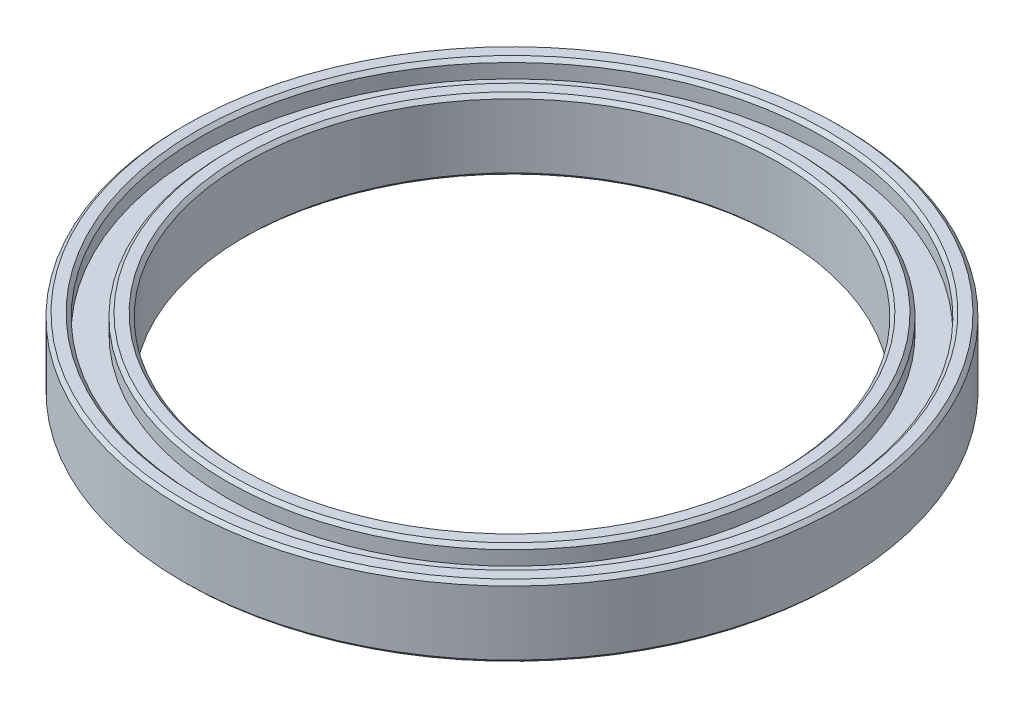
ISO-10303-21;
HEADER;
FILE_DESCRIPTION(('STEP AP214'),'2;1');
FILE_NAME('part.step','',(''),(''),'','','');
FILE_SCHEMA(('AUTOMOTIVE_DESIGN { 1 0 10303 214 1 1 1 1 }'));
ENDSEC;
DATA;
#1=APPLICATION_CONTEXT('core data for automotive mechanical design processes');
#2=APPLICATION_PROTOCOL_DEFINITION('international standard','automotive_design',2000,#1);
#3=PRODUCT_CONTEXT('',#1,'mechanical');
#4=PRODUCT('Part','Part','',(#3));
#5=PRODUCT_RELATED_PRODUCT_CATEGORY('part','',(#4));
#6=PRODUCT_DEFINITION_FORMATION('','',#4);
#7=PRODUCT_DEFINITION_CONTEXT('part definition',#1,'design');
#8=PRODUCT_DEFINITION('design','',#6,#7);
#9=PRODUCT_DEFINITION_SHAPE('','',#8);
#10=(LENGTH_UNIT() NAMED_UNIT(*) SI_UNIT(.MILLI.,.METRE.));
#11=(NAMED_UNIT(*) PLANE_ANGLE_UNIT() SI_UNIT($,.RADIAN.));
#12=(NAMED_UNIT(*) SI_UNIT($,.STERADIAN.) SOLID_ANGLE_UNIT());
#13=UNCERTAINTY_MEASURE_WITH_UNIT(LENGTH_MEASURE(1.E-05),#10,'distance_accuracy_value','');
#14=(GEOMETRIC_REPRESENTATION_CONTEXT(3) GLOBAL_UNCERTAINTY_ASSIGNED_CONTEXT((#13)) GLOBAL_UNIT_ASSIGNED_CONTEXT((#10,
#11,#12)) REPRESENTATION_CONTEXT('',''));
#15=CARTESIAN_POINT('',(0.,0.,0.));
#16=DIRECTION('',(0.,0.,1.));
#17=DIRECTION('',(1.,0.,0.));
#18=AXIS2_PLACEMENT_3D('',#15,#16,#17);
#19=CARTESIAN_POINT('',(0.,0.,0.));
#20=DIRECTION('',(0.,1.,0.));
#21=DIRECTION('',(0.,0.,1.));
#22=AXIS2_PLACEMENT_3D('',#19,#20,#21);
#23=PLANE('',#22);
#24=CARTESIAN_POINT('',(0.,0.,0.));
#25=DIRECTION('',(0.,1.,0.));
#26=DIRECTION('',(0.,0.,1.));
#27=AXIS2_PLACEMENT_3D('',#24,#25,#26);
#28=CIRCLE('',#27,15.8);
#29=CARTESIAN_POINT('',(0.,0.,15.8));
#30=VERTEX_POINT('',#29);
#31=EDGE_CURVE('E51',#30,#30,#28,.F.);
#32=ORIENTED_EDGE('',*,*,#31,.T.);
#33=EDGE_LOOP('',(#32));
#34=FACE_BOUND('',#33,.T.);
#35=CARTESIAN_POINT('',(0.,0.,0.));
#36=DIRECTION('',(0.,1.,0.));
#37=DIRECTION('',(0.,0.,1.));
#38=AXIS2_PLACEMENT_3D('',#35,#36,#37);
#39=CIRCLE('',#38,15.2);
#40=CARTESIAN_POINT('',(0.,0.,15.2));
#41=VERTEX_POINT('',#40);
#42=EDGE_CURVE('E55',#41,#41,#39,.T.);
#43=ORIENTED_EDGE('',*,*,#42,.T.);
#44=EDGE_LOOP('',(#43));
#45=FACE_BOUND('',#44,.T.);
#46=ADVANCED_FACE('F43',(#34,#45),#23,.F.);
#47=CARTESIAN_POINT('',(0.,4.,0.));
#48=DIRECTION('',(0.,1.,0.));
#49=DIRECTION('',(0.,0.,1.));
#50=AXIS2_PLACEMENT_3D('',#47,#48,#49);
#51=PLANE('',#50);
#52=CARTESIAN_POINT('',(0.,4.,0.));
#53=DIRECTION('',(0.,1.,0.));
#54=DIRECTION('',(0.,0.,1.));
#55=AXIS2_PLACEMENT_3D('',#52,#53,#54);
#56=CIRCLE('',#55,15.8);
#57=CARTESIAN_POINT('',(0.,4.,15.8));
#58=VERTEX_POINT('',#57);
#59=EDGE_CURVE('E94',#58,#58,#56,.T.);
#60=ORIENTED_EDGE('',*,*,#59,.T.);
#61=EDGE_LOOP('',(#60));
#62=FACE_BOUND('',#61,.T.);
#63=CARTESIAN_POINT('',(0.,4.,0.));
#64=DIRECTION('',(0.,1.,0.));
#65=DIRECTION('',(0.,0.,1.));
#66=AXIS2_PLACEMENT_3D('',#63,#64,#65);
#67=CIRCLE('',#66,15.2);
#68=CARTESIAN_POINT('',(0.,4.,15.2));
#69=VERTEX_POINT('',#68);
#70=EDGE_CURVE('E97',#69,#69,#67,.F.);
#71=ORIENTED_EDGE('',*,*,#70,.T.);
#72=EDGE_LOOP('',(#71));
#73=FACE_BOUND('',#72,.T.);
#74=ADVANCED_FACE('F134',(#62,#73),#51,.T.);
#75=CARTESIAN_POINT('',(0.,4.,0.));
#76=DIRECTION('',(0.,1.,0.));
#77=DIRECTION('',(0.,0.,1.));
#78=AXIS2_PLACEMENT_3D('',#75,#76,#77);
#79=CIRCLE('',#78,18.3);
#80=CARTESIAN_POINT('',(0.,4.,18.3));
#81=VERTEX_POINT('',#80);
#82=EDGE_CURVE('E79',#81,#81,#79,.T.);
#83=ORIENTED_EDGE('',*,*,#82,.T.);
#84=EDGE_LOOP('',(#83));
#85=FACE_BOUND('',#84,.T.);
#86=CARTESIAN_POINT('',(0.,4.,0.));
#87=DIRECTION('',(0.,1.,0.));
#88=DIRECTION('',(0.,0.,1.));
#89=AXIS2_PLACEMENT_3D('',#86,#87,#88);
#90=CIRCLE('',#89,17.7);
#91=CARTESIAN_POINT('',(0.,4.,17.7));
#92=VERTEX_POINT('',#91);
#93=EDGE_CURVE('E82',#92,#92,#90,.F.);
#94=ORIENTED_EDGE('',*,*,#93,.T.);
#95=EDGE_LOOP('',(#94));
#96=FACE_BOUND('',#95,.T.);
#97=ADVANCED_FACE('F140',(#85,#96),#51,.T.);
#98=CARTESIAN_POINT('',(0.,0.,0.));
#99=DIRECTION('',(0.,1.,0.));
#100=DIRECTION('',(0.,0.,1.));
#101=AXIS2_PLACEMENT_3D('',#98,#99,#100);
#102=CIRCLE('',#101,18.3);
#103=CARTESIAN_POINT('',(0.,0.,18.3));
#104=VERTEX_POINT('',#103);
#105=EDGE_CURVE('E64',#104,#104,#102,.F.);
#106=ORIENTED_EDGE('',*,*,#105,.T.);
#107=EDGE_LOOP('',(#106));
#108=FACE_BOUND('',#107,.T.);
#109=CARTESIAN_POINT('',(0.,0.,0.));
#110=DIRECTION('',(0.,1.,0.));
#111=DIRECTION('',(0.,0.,1.));
#112=AXIS2_PLACEMENT_3D('',#109,#110,#111);
#113=CIRCLE('',#112,17.7);
#114=CARTESIAN_POINT('',(0.,0.,17.7));
#115=VERTEX_POINT('',#114);
#116=EDGE_CURVE('E67',#115,#115,#113,.T.);
#117=ORIENTED_EDGE('',*,*,#116,.T.);
#118=EDGE_LOOP('',(#117));
#119=FACE_BOUND('',#118,.T.);
#120=ADVANCED_FACE('F136',(#108,#119),#23,.F.);
#121=CARTESIAN_POINT('',(0.,4.,0.));
#122=DIRECTION('',(0.,-1.,0.));
#123=DIRECTION('',(0.,0.,-1.));
#124=AXIS2_PLACEMENT_3D('',#121,#122,#123);
#125=CYLINDRICAL_SURFACE('',#124,18.5);
#126=CARTESIAN_POINT('',(0.,3.80000000000003,0.));
#127=DIRECTION('',(0.,1.,0.));
#128=DIRECTION('',(0.,0.,1.));
#129=AXIS2_PLACEMENT_3D('',#126,#127,#128);
#130=CIRCLE('',#129,18.5);
#131=CARTESIAN_POINT('',(0.,3.80000000000003,18.5));
#132=VERTEX_POINT('',#131);
#133=EDGE_CURVE('E73',#132,#132,#130,.F.);
#134=ORIENTED_EDGE('',*,*,#133,.T.);
#135=EDGE_LOOP('',(#134));
#136=FACE_BOUND('',#135,.T.);
#137=CARTESIAN_POINT('',(0.,0.199999999999999,0.));
#138=DIRECTION('',(0.,1.,0.));
#139=DIRECTION('',(0.,0.,1.));
#140=AXIS2_PLACEMENT_3D('',#137,#138,#139);
#141=CIRCLE('',#140,18.5);
#142=CARTESIAN_POINT('',(0.,0.199999999999999,18.5));
#143=VERTEX_POINT('',#142);
#144=EDGE_CURVE('E76',#143,#143,#141,.T.);
#145=ORIENTED_EDGE('',*,*,#144,.T.);
#146=EDGE_LOOP('',(#145));
#147=FACE_BOUND('',#146,.T.);
#148=ADVANCED_FACE('F146',(#136,#147),#125,.T.);
#149=CARTESIAN_POINT('',(0.,4.,0.));
#150=DIRECTION('',(0.,-1.,0.));
#151=DIRECTION('',(0.,0.,-1.));
#152=AXIS2_PLACEMENT_3D('',#149,#150,#151);
#153=CYLINDRICAL_SURFACE('',#152,15.);
#154=CARTESIAN_POINT('',(0.,3.80000000000001,0.));
#155=DIRECTION('',(0.,1.,0.));
#156=DIRECTION('',(0.,0.,1.));
#157=AXIS2_PLACEMENT_3D('',#154,#155,#156);
#158=CIRCLE('',#157,15.);
#159=CARTESIAN_POINT('',(0.,3.80000000000001,15.));
#160=VERTEX_POINT('',#159);
#161=EDGE_CURVE('E85',#160,#160,#158,.T.);
#162=ORIENTED_EDGE('',*,*,#161,.T.);
#163=EDGE_LOOP('',(#162));
#164=FACE_BOUND('',#163,.T.);
#165=CARTESIAN_POINT('',(0.,0.199999999999997,0.));
#166=DIRECTION('',(0.,1.,0.));
#167=DIRECTION('',(0.,0.,1.));
#168=AXIS2_PLACEMENT_3D('',#165,#166,#167);
#169=CIRCLE('',#168,15.);
#170=CARTESIAN_POINT('',(0.,0.199999999999997,15.));
#171=VERTEX_POINT('',#170);
#172=EDGE_CURVE('E88',#171,#171,#169,.F.);
#173=ORIENTED_EDGE('',*,*,#172,.T.);
#174=EDGE_LOOP('',(#173));
#175=FACE_BOUND('',#174,.T.);
#176=ADVANCED_FACE('F152',(#164,#175),#153,.F.);
#177=CARTESIAN_POINT('',(0.,3.,0.));
#178=DIRECTION('',(0.,1.,0.));
#179=DIRECTION('',(0.,0.,1.));
#180=AXIS2_PLACEMENT_3D('',#177,#178,#179);
#181=CYLINDRICAL_SURFACE('',#180,17.5);
#182=CARTESIAN_POINT('',(0.,3.79999999999999,0.));
#183=DIRECTION('',(0.,1.,0.));
#184=DIRECTION('',(0.,0.,1.));
#185=AXIS2_PLACEMENT_3D('',#182,#183,#184);
#186=CIRCLE('',#185,17.5);
#187=CARTESIAN_POINT('',(0.,3.79999999999999,17.5));
#188=VERTEX_POINT('',#187);
#189=EDGE_CURVE('E70',#188,#188,#186,.T.);
#190=ORIENTED_EDGE('',*,*,#189,.T.);
#191=EDGE_LOOP('',(#190));
#192=FACE_BOUND('',#191,.T.);
#193=CARTESIAN_POINT('',(0.,3.,0.));
#194=DIRECTION('',(0.,1.,0.));
#195=DIRECTION('',(0.,0.,1.));
#196=AXIS2_PLACEMENT_3D('',#193,#194,#195);
#197=CIRCLE('',#196,17.5);
#198=CARTESIAN_POINT('',(0.,3.,17.5));
#199=VERTEX_POINT('',#198);
#200=EDGE_CURVE('E100',#199,#199,#197,.T.);
#201=ORIENTED_EDGE('',*,*,#200,.F.);
#202=EDGE_LOOP('',(#201));
#203=FACE_BOUND('',#202,.T.);
#204=ADVANCED_FACE('F225',(#192,#203),#181,.F.);
#205=CARTESIAN_POINT('',(0.,3.,0.));
#206=DIRECTION('',(0.,1.,0.));
#207=DIRECTION('',(0.,0.,1.));
#208=AXIS2_PLACEMENT_3D('',#205,#206,#207);
#209=PLANE('',#208);
#210=CARTESIAN_POINT('',(0.,3.,0.));
#211=DIRECTION('',(0.,1.,0.));
#212=DIRECTION('',(0.,0.,1.));
#213=AXIS2_PLACEMENT_3D('',#210,#211,#212);
#214=CIRCLE('',#213,16.);
#215=CARTESIAN_POINT('',(0.,3.,16.));
#216=VERTEX_POINT('',#215);
#217=EDGE_CURVE('E103',#216,#216,#214,.T.);
#218=ORIENTED_EDGE('',*,*,#217,.F.);
#219=EDGE_LOOP('',(#218));
#220=FACE_BOUND('',#219,.T.);
#221=ORIENTED_EDGE('',*,*,#200,.T.);
#222=EDGE_LOOP('',(#221));
#223=FACE_BOUND('',#222,.T.);
#224=ADVANCED_FACE('F130',(#220,#223),#209,.T.);
#225=CARTESIAN_POINT('',(0.,3.,0.));
#226=DIRECTION('',(0.,1.,0.));
#227=DIRECTION('',(0.,0.,1.));
#228=AXIS2_PLACEMENT_3D('',#225,#226,#227);
#229=CYLINDRICAL_SURFACE('',#228,16.);
#230=CARTESIAN_POINT('',(0.,3.80000000000001,0.));
#231=DIRECTION('',(0.,1.,0.));
#232=DIRECTION('',(0.,0.,1.));
#233=AXIS2_PLACEMENT_3D('',#230,#231,#232);
#234=CIRCLE('',#233,16.);
#235=CARTESIAN_POINT('',(0.,3.80000000000001,16.));
#236=VERTEX_POINT('',#235);
#237=EDGE_CURVE('E91',#236,#236,#234,.F.);
#238=ORIENTED_EDGE('',*,*,#237,.T.);
#239=EDGE_LOOP('',(#238));
#240=FACE_BOUND('',#239,.T.);
#241=ORIENTED_EDGE('',*,*,#217,.T.);
#242=EDGE_LOOP('',(#241));
#243=FACE_BOUND('',#242,.T.);
#244=ADVANCED_FACE('F123',(#240,#243),#229,.T.);
#245=CARTESIAN_POINT('',(0.,1.,0.));
#246=DIRECTION('',(0.,-1.,0.));
#247=DIRECTION('',(0.,0.,-1.));
#248=AXIS2_PLACEMENT_3D('',#245,#246,#247);
#249=CYLINDRICAL_SURFACE('',#248,17.5);
#250=CARTESIAN_POINT('',(0.,0.200000000000013,0.));
#251=DIRECTION('',(0.,1.,0.));
#252=DIRECTION('',(0.,0.,1.));
#253=AXIS2_PLACEMENT_3D('',#250,#251,#252);
#254=CIRCLE('',#253,17.5);
#255=CARTESIAN_POINT('',(0.,0.200000000000013,17.5));
#256=VERTEX_POINT('',#255);
#257=EDGE_CURVE('E59',#256,#256,#254,.F.);
#258=ORIENTED_EDGE('',*,*,#257,.T.);
#259=EDGE_LOOP('',(#258));
#260=FACE_BOUND('',#259,.T.);
#261=CARTESIAN_POINT('',(0.,1.,0.));
#262=DIRECTION('',(0.,-1.,0.));
#263=DIRECTION('',(0.,0.,-1.));
#264=AXIS2_PLACEMENT_3D('',#261,#262,#263);
#265=CIRCLE('',#264,17.5);
#266=CARTESIAN_POINT('',(0.,1.,-17.5));
#267=VERTEX_POINT('',#266);
#268=EDGE_CURVE('E106',#267,#267,#265,.T.);
#269=ORIENTED_EDGE('',*,*,#268,.F.);
#270=EDGE_LOOP('',(#269));
#271=FACE_BOUND('',#270,.T.);
#272=ADVANCED_FACE('F118',(#260,#271),#249,.F.);
#273=CARTESIAN_POINT('',(0.,1.,0.));
#274=DIRECTION('',(0.,-1.,0.));
#275=DIRECTION('',(0.,0.,-1.));
#276=AXIS2_PLACEMENT_3D('',#273,#274,#275);
#277=PLANE('',#276);
#278=CARTESIAN_POINT('',(0.,1.,0.));
#279=DIRECTION('',(0.,-1.,0.));
#280=DIRECTION('',(0.,0.,-1.));
#281=AXIS2_PLACEMENT_3D('',#278,#279,#280);
#282=CIRCLE('',#281,16.);
#283=CARTESIAN_POINT('',(0.,1.,-16.));
#284=VERTEX_POINT('',#283);
#285=EDGE_CURVE('E109',#284,#284,#282,.T.);
#286=ORIENTED_EDGE('',*,*,#285,.F.);
#287=EDGE_LOOP('',(#286));
#288=FACE_BOUND('',#287,.T.);
#289=ORIENTED_EDGE('',*,*,#268,.T.);
#290=EDGE_LOOP('',(#289));
#291=FACE_BOUND('',#290,.T.);
#292=ADVANCED_FACE('F115',(#288,#291),#277,.T.);
#293=CARTESIAN_POINT('',(0.,1.,0.));
#294=DIRECTION('',(0.,-1.,0.));
#295=DIRECTION('',(0.,0.,-1.));
#296=AXIS2_PLACEMENT_3D('',#293,#294,#295);
#297=CYLINDRICAL_SURFACE('',#296,16.);
#298=CARTESIAN_POINT('',(0.,0.199999999999992,0.));
#299=DIRECTION('',(0.,1.,0.));
#300=DIRECTION('',(0.,0.,1.));
#301=AXIS2_PLACEMENT_3D('',#298,#299,#300);
#302=CIRCLE('',#301,16.);
#303=CARTESIAN_POINT('',(0.,0.199999999999992,16.));
#304=VERTEX_POINT('',#303);
#305=EDGE_CURVE('E10',#304,#304,#302,.T.);
#306=ORIENTED_EDGE('',*,*,#305,.T.);
#307=EDGE_LOOP('',(#306));
#308=FACE_BOUND('',#307,.T.);
#309=ORIENTED_EDGE('',*,*,#285,.T.);
#310=EDGE_LOOP('',(#309));
#311=FACE_BOUND('',#310,.T.);
#312=ADVANCED_FACE('F113',(#308,#311),#297,.T.);
#313=CARTESIAN_POINT('',(0.,4.,0.));
#314=DIRECTION('',(0.,-1.,0.));
#315=DIRECTION('',(0.,0.,-1.));
#316=AXIS2_PLACEMENT_3D('',#313,#314,#315);
#317=CONICAL_SURFACE('',#316,15.8,0.785398163397431);
#318=ORIENTED_EDGE('',*,*,#237,.F.);
#319=EDGE_LOOP('',(#318));
#320=FACE_BOUND('',#319,.T.);
#321=ORIENTED_EDGE('',*,*,#59,.F.);
#322=EDGE_LOOP('',(#321));
#323=FACE_BOUND('',#322,.T.);
#324=ADVANCED_FACE('F206',(#320,#323),#317,.T.);
#325=CARTESIAN_POINT('',(0.,3.80000000000001,0.));
#326=DIRECTION('',(0.,1.,0.));
#327=DIRECTION('',(0.,0.,1.));
#328=AXIS2_PLACEMENT_3D('',#325,#326,#327);
#329=CONICAL_SURFACE('',#328,15.,0.785398163397457);
#330=CARTESIAN_POINT('',(0.,4.,15.2));
#331=CARTESIAN_POINT('',(0.,3.99791666666667,15.1979166666667));
#332=CARTESIAN_POINT('',(0.,3.99583333333333,15.1958333333333));
#333=CARTESIAN_POINT('',(0.,3.99166666666667,15.1916666666667));
#334=CARTESIAN_POINT('',(0.,3.98958333333333,15.1895833333333));
#335=CARTESIAN_POINT('',(0.,3.98541666666667,15.1854166666667));
#336=CARTESIAN_POINT('',(0.,3.98333333333333,15.1833333333333));
#337=CARTESIAN_POINT('',(0.,3.97916666666667,15.1791666666667));
#338=CARTESIAN_POINT('',(0.,3.97708333333333,15.1770833333333));
#339=CARTESIAN_POINT('',(0.,3.97291666666667,15.1729166666667));
#340=CARTESIAN_POINT('',(0.,3.97083333333333,15.1708333333333));
#341=CARTESIAN_POINT('',(0.,3.96666666666667,15.1666666666667));
#342=CARTESIAN_POINT('',(0.,3.96458333333333,15.1645833333333));
#343=CARTESIAN_POINT('',(0.,3.96041666666667,15.1604166666667));
#344=CARTESIAN_POINT('',(0.,3.95833333333334,15.1583333333333));
#345=CARTESIAN_POINT('',(0.,3.95416666666667,15.1541666666667));
#346=CARTESIAN_POINT('',(0.,3.95208333333334,15.1520833333333));
#347=CARTESIAN_POINT('',(0.,3.94791666666667,15.1479166666667));
#348=CARTESIAN_POINT('',(0.,3.94583333333334,15.1458333333333));
#349=CARTESIAN_POINT('',(0.,3.94166666666667,15.1416666666667));
#350=CARTESIAN_POINT('',(0.,3.93958333333334,15.1395833333333));
#351=CARTESIAN_POINT('',(0.,3.93541666666667,15.1354166666667));
#352=CARTESIAN_POINT('',(0.,3.93333333333334,15.1333333333333));
#353=CARTESIAN_POINT('',(0.,3.92916666666667,15.1291666666667));
#354=CARTESIAN_POINT('',(0.,3.92708333333334,15.1270833333333));
#355=CARTESIAN_POINT('',(0.,3.92291666666667,15.1229166666667));
#356=CARTESIAN_POINT('',(0.,3.92083333333334,15.1208333333333));
#357=CARTESIAN_POINT('',(0.,3.91666666666667,15.1166666666667));
#358=CARTESIAN_POINT('',(0.,3.91458333333334,15.1145833333333));
#359=CARTESIAN_POINT('',(0.,3.91041666666667,15.1104166666667));
#360=CARTESIAN_POINT('',(0.,3.90833333333334,15.1083333333333));
#361=CARTESIAN_POINT('',(0.,3.90416666666667,15.1041666666667));
#362=CARTESIAN_POINT('',(0.,3.90208333333334,15.1020833333333));
#363=CARTESIAN_POINT('',(0.,3.89791666666667,15.0979166666667));
#364=CARTESIAN_POINT('',(0.,3.89583333333334,15.0958333333333));
#365=CARTESIAN_POINT('',(0.,3.89166666666667,15.0916666666667));
#366=CARTESIAN_POINT('',(0.,3.88958333333334,15.0895833333333));
#367=CARTESIAN_POINT('',(0.,3.88541666666667,15.0854166666667));
#368=CARTESIAN_POINT('',(0.,3.88333333333334,15.0833333333333));
#369=CARTESIAN_POINT('',(0.,3.87916666666667,15.0791666666667));
#370=CARTESIAN_POINT('',(0.,3.87708333333334,15.0770833333333));
#371=CARTESIAN_POINT('',(0.,3.87291666666667,15.0729166666667));
#372=CARTESIAN_POINT('',(0.,3.87083333333334,15.0708333333333));
#373=CARTESIAN_POINT('',(0.,3.86666666666667,15.0666666666667));
#374=CARTESIAN_POINT('',(0.,3.86458333333334,15.0645833333333));
#375=CARTESIAN_POINT('',(0.,3.86041666666667,15.0604166666667));
#376=CARTESIAN_POINT('',(0.,3.85833333333334,15.0583333333333));
#377=CARTESIAN_POINT('',(0.,3.85416666666667,15.0541666666667));
#378=CARTESIAN_POINT('',(0.,3.85208333333334,15.0520833333333));
#379=CARTESIAN_POINT('',(0.,3.84791666666668,15.0479166666667));
#380=CARTESIAN_POINT('',(0.,3.84583333333334,15.0458333333333));
#381=CARTESIAN_POINT('',(0.,3.84166666666668,15.0416666666667));
#382=CARTESIAN_POINT('',(0.,3.83958333333334,15.0395833333333));
#383=CARTESIAN_POINT('',(0.,3.83541666666668,15.0354166666667));
#384=CARTESIAN_POINT('',(0.,3.83333333333334,15.0333333333333));
#385=CARTESIAN_POINT('',(0.,3.82916666666668,15.0291666666667));
#386=CARTESIAN_POINT('',(0.,3.82708333333334,15.0270833333333));
#387=CARTESIAN_POINT('',(0.,3.82291666666668,15.0229166666667));
#388=CARTESIAN_POINT('',(0.,3.82083333333334,15.0208333333333));
#389=CARTESIAN_POINT('',(0.,3.81666666666668,15.0166666666667));
#390=CARTESIAN_POINT('',(0.,3.81458333333334,15.0145833333333));
#391=CARTESIAN_POINT('',(0.,3.81041666666668,15.0104166666667));
#392=CARTESIAN_POINT('',(0.,3.80833333333334,15.0083333333333));
#393=CARTESIAN_POINT('',(0.,3.80416666666668,15.0041666666667));
#394=CARTESIAN_POINT('',(0.,3.80208333333334,15.0020833333333));
#395=CARTESIAN_POINT('',(0.,3.80000000000001,15.));
#396=B_SPLINE_CURVE_WITH_KNOTS('',3,(#330,#331,#332,#333,#334,#335,#336,#337,#338,#339,#340,
#341,#342,#343,#344,#345,#346,#347,#348,#349,#350,#351,#352,#353,#354,#355,#356,#357,#358,#359,
#360,#361,#362,#363,#364,#365,#366,#367,#368,#369,#370,#371,#372,#373,#374,#375,#376,#377,#378,
#379,#380,#381,#382,#383,#384,#385,#386,#387,#388,#389,#390,#391,#392,#393,#394,#395),
.UNSPECIFIED.,.F.,.F.,(4,2,2,2,2,2,2,2,2,2,2,2,2,2,2,2,2,2,2,2,2,2,2,2,2,2,2,2,2,2,2,2,4),(0.,
0.00883883476483087,0.017677669529663,0.0265165042944944,0.0353553390593253,0.0441941738241562,
0.0530330085889889,0.0618718433538198,0.0707106781186506,0.0795495128834821,0.0883883476483142,
0.0972271824131457,0.106066017177977,0.114904851942807,0.12374368670764,0.132582521472471,
0.141421356237302,0.150260191002133,0.159099025766965,0.167937860531797,0.176776695296628,
0.185615530061459,0.194454364826291,0.203293199591122,0.212132034355953,0.220970869120784,
0.229809703885617,0.238648538650448,0.247487373415279,0.25632620818011,0.265165042944942,
0.274003877709774,0.282842712474604),.UNSPECIFIED.);
#397=EDGE_CURVE('BSEAM199',#69,#160,#396,.T.);
#398=ORIENTED_EDGE('',*,*,#70,.F.);
#399=ORIENTED_EDGE('',*,*,#161,.F.);
#400=ORIENTED_EDGE('',*,*,#397,.T.);
#401=ORIENTED_EDGE('',*,*,#397,.F.);
#402=EDGE_LOOP('',(#398,#400,#399,#401));
#403=FACE_BOUND('',#402,.T.);
#404=ADVANCED_FACE('F199',(#403),#329,.F.);
#405=CARTESIAN_POINT('',(0.,4.,0.));
#406=DIRECTION('',(0.,-1.,0.));
#407=DIRECTION('',(0.,0.,-1.));
#408=AXIS2_PLACEMENT_3D('',#405,#406,#407);
#409=CONICAL_SURFACE('',#408,18.3,0.785398163397431);
#410=ORIENTED_EDGE('',*,*,#133,.F.);
#411=EDGE_LOOP('',(#410));
#412=FACE_BOUND('',#411,.T.);
#413=ORIENTED_EDGE('',*,*,#82,.F.);
#414=EDGE_LOOP('',(#413));
#415=FACE_BOUND('',#414,.T.);
#416=ADVANCED_FACE('F192',(#412,#415),#409,.T.);
#417=CARTESIAN_POINT('',(0.,3.79999999999999,0.));
#418=DIRECTION('',(0.,1.,0.));
#419=DIRECTION('',(0.,0.,1.));
#420=AXIS2_PLACEMENT_3D('',#417,#418,#419);
#421=CONICAL_SURFACE('',#420,17.5,0.78539816339744);
#422=ORIENTED_EDGE('',*,*,#93,.F.);
#423=EDGE_LOOP('',(#422));
#424=FACE_BOUND('',#423,.T.);
#425=ORIENTED_EDGE('',*,*,#189,.F.);
#426=EDGE_LOOP('',(#425));
#427=FACE_BOUND('',#426,.T.);
#428=ADVANCED_FACE('F171',(#424,#427),#421,.F.);
#429=CARTESIAN_POINT('',(0.,0.199999999999999,0.));
#430=DIRECTION('',(0.,1.,0.));
#431=DIRECTION('',(0.,0.,1.));
#432=AXIS2_PLACEMENT_3D('',#429,#430,#431);
#433=CONICAL_SURFACE('',#432,18.5,0.785398163397457);
#434=ORIENTED_EDGE('',*,*,#105,.F.);
#435=EDGE_LOOP('',(#434));
#436=FACE_BOUND('',#435,.T.);
#437=ORIENTED_EDGE('',*,*,#144,.F.);
#438=EDGE_LOOP('',(#437));
#439=FACE_BOUND('',#438,.T.);
#440=ADVANCED_FACE('F163',(#436,#439),#433,.T.);
#441=CARTESIAN_POINT('',(0.,0.200000000000013,0.));
#442=DIRECTION('',(0.,-1.,0.));
#443=DIRECTION('',(0.,0.,-1.));
#444=AXIS2_PLACEMENT_3D('',#441,#442,#443);
#445=CONICAL_SURFACE('',#444,17.5,0.785398163397474);
#446=ORIENTED_EDGE('',*,*,#116,.F.);
#447=EDGE_LOOP('',(#446));
#448=FACE_BOUND('',#447,.T.);
#449=ORIENTED_EDGE('',*,*,#257,.F.);
#450=EDGE_LOOP('',(#449));
#451=FACE_BOUND('',#450,.T.);
#452=ADVANCED_FACE('F159',(#448,#451),#445,.F.);
#453=CARTESIAN_POINT('',(0.,0.,0.));
#454=DIRECTION('',(0.,1.,0.));
#455=DIRECTION('',(0.,0.,1.));
#456=AXIS2_PLACEMENT_3D('',#453,#454,#455);
#457=CONICAL_SURFACE('',#456,15.8,0.785398163397431);
#458=ORIENTED_EDGE('',*,*,#305,.F.);
#459=EDGE_LOOP('',(#458));
#460=FACE_BOUND('',#459,.T.);
#461=ORIENTED_EDGE('',*,*,#31,.F.);
#462=EDGE_LOOP('',(#461));
#463=FACE_BOUND('',#462,.T.);
#464=ADVANCED_FACE('F162',(#460,#463),#457,.T.);
#465=CARTESIAN_POINT('',(0.,0.,0.));
#466=DIRECTION('',(0.,-1.,0.));
#467=DIRECTION('',(0.,0.,-1.));
#468=AXIS2_PLACEMENT_3D('',#465,#466,#467);
#469=CONICAL_SURFACE('',#468,15.2,0.78539816339744);
#470=ORIENTED_EDGE('',*,*,#172,.F.);
#471=EDGE_LOOP('',(#470));
#472=FACE_BOUND('',#471,.T.);
#473=ORIENTED_EDGE('',*,*,#42,.F.);
#474=EDGE_LOOP('',(#473));
#475=FACE_BOUND('',#474,.T.);
#476=ADVANCED_FACE('F46',(#472,#475),#469,.F.);
#477=CLOSED_SHELL('',(#46,#74,#97,#120,#148,#176,#204,#224,#244,#272,#292,#312,#324,#404,#416,
#428,#440,#452,#464,#476));
#478=MANIFOLD_SOLID_BREP('B2',#477);
#479=ADVANCED_BREP_SHAPE_REPRESENTATION('',(#18,#478),#14);
#480=SHAPE_DEFINITION_REPRESENTATION(#9,#479);
ENDSEC;
END-ISO-10303-21;
